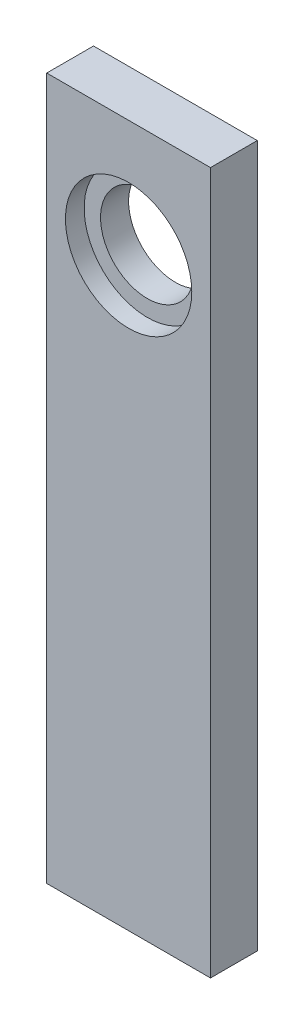
ISO-10303-21;
HEADER;
FILE_DESCRIPTION(('STEP AP214'),'2;1');
FILE_NAME('part.step','',(''),(''),'','','');
FILE_SCHEMA(('AUTOMOTIVE_DESIGN { 1 0 10303 214 1 1 1 1 }'));
ENDSEC;
DATA;
#1=APPLICATION_CONTEXT('core data for automotive mechanical design processes');
#2=APPLICATION_PROTOCOL_DEFINITION('international standard','automotive_design',2000,#1);
#3=PRODUCT_CONTEXT('',#1,'mechanical');
#4=PRODUCT('Part','Part','',(#3));
#5=PRODUCT_RELATED_PRODUCT_CATEGORY('part','',(#4));
#6=PRODUCT_DEFINITION_FORMATION('','',#4);
#7=PRODUCT_DEFINITION_CONTEXT('part definition',#1,'design');
#8=PRODUCT_DEFINITION('design','',#6,#7);
#9=PRODUCT_DEFINITION_SHAPE('','',#8);
#10=(LENGTH_UNIT() NAMED_UNIT(*) SI_UNIT(.MILLI.,.METRE.));
#11=(NAMED_UNIT(*) PLANE_ANGLE_UNIT() SI_UNIT($,.RADIAN.));
#12=(NAMED_UNIT(*) SI_UNIT($,.STERADIAN.) SOLID_ANGLE_UNIT());
#13=UNCERTAINTY_MEASURE_WITH_UNIT(LENGTH_MEASURE(1.E-05),#10,'distance_accuracy_value','');
#14=(GEOMETRIC_REPRESENTATION_CONTEXT(3) GLOBAL_UNCERTAINTY_ASSIGNED_CONTEXT((#13)) GLOBAL_UNIT_ASSIGNED_CONTEXT((#10,
#11,#12)) REPRESENTATION_CONTEXT('',''));
#15=CARTESIAN_POINT('',(0.,0.,0.));
#16=DIRECTION('',(0.,0.,1.));
#17=DIRECTION('',(1.,0.,0.));
#18=AXIS2_PLACEMENT_3D('',#15,#16,#17);
#19=CARTESIAN_POINT('',(-17.5,-25.,10.));
#20=DIRECTION('',(0.,1.,0.));
#21=DIRECTION('',(0.,0.,1.));
#22=AXIS2_PLACEMENT_3D('',#19,#20,#21);
#23=PLANE('',#22);
#24=DIRECTION('',(1.,0.,0.));
#25=VECTOR('',#24,1.);
#26=CARTESIAN_POINT('',(-17.5,-25.,0.));
#27=LINE('',#26,#25);
#28=CARTESIAN_POINT('',(-17.5,-25.,0.));
#29=VERTEX_POINT('',#28);
#30=CARTESIAN_POINT('',(17.5,-25.,0.));
#31=VERTEX_POINT('',#30);
#32=EDGE_CURVE('E93',#29,#31,#27,.T.);
#33=ORIENTED_EDGE('',*,*,#32,.T.);
#34=DIRECTION('',(0.,0.,-1.));
#35=VECTOR('',#34,1.);
#36=CARTESIAN_POINT('',(17.5,-25.,10.));
#37=LINE('',#36,#35);
#38=CARTESIAN_POINT('',(17.5,-25.,10.));
#39=VERTEX_POINT('',#38);
#40=EDGE_CURVE('E46',#39,#31,#37,.T.);
#41=ORIENTED_EDGE('',*,*,#40,.F.);
#42=DIRECTION('',(1.,0.,0.));
#43=VECTOR('',#42,1.);
#44=CARTESIAN_POINT('',(-17.5,-25.,10.));
#45=LINE('',#44,#43);
#46=CARTESIAN_POINT('',(-17.5,-25.,10.));
#47=VERTEX_POINT('',#46);
#48=EDGE_CURVE('E85',#47,#39,#45,.T.);
#49=ORIENTED_EDGE('',*,*,#48,.F.);
#50=DIRECTION('',(0.,0.,-1.));
#51=VECTOR('',#50,1.);
#52=CARTESIAN_POINT('',(-17.5,-25.,10.));
#53=LINE('',#52,#51);
#54=EDGE_CURVE('E11',#47,#29,#53,.T.);
#55=ORIENTED_EDGE('',*,*,#54,.T.);
#56=EDGE_LOOP('',(#33,#41,#49,#55));
#57=FACE_BOUND('',#56,.T.);
#58=ADVANCED_FACE('F37',(#57),#23,.F.);
#59=CARTESIAN_POINT('',(17.5,125.,10.));
#60=DIRECTION('',(-1.,0.,0.));
#61=DIRECTION('',(0.,-1.,0.));
#62=AXIS2_PLACEMENT_3D('',#59,#60,#61);
#63=PLANE('',#62);
#64=DIRECTION('',(0.,1.,0.));
#65=VECTOR('',#64,1.);
#66=CARTESIAN_POINT('',(17.5,125.,0.));
#67=LINE('',#66,#65);
#68=CARTESIAN_POINT('',(17.5,125.,0.));
#69=VERTEX_POINT('',#68);
#70=EDGE_CURVE('E72',#31,#69,#67,.T.);
#71=ORIENTED_EDGE('',*,*,#70,.T.);
#72=DIRECTION('',(0.,0.,-1.));
#73=VECTOR('',#72,1.);
#74=CARTESIAN_POINT('',(17.5,125.,10.));
#75=LINE('',#74,#73);
#76=CARTESIAN_POINT('',(17.5,125.,10.));
#77=VERTEX_POINT('',#76);
#78=EDGE_CURVE('E95',#77,#69,#75,.T.);
#79=ORIENTED_EDGE('',*,*,#78,.F.);
#80=DIRECTION('',(0.,1.,0.));
#81=VECTOR('',#80,1.);
#82=CARTESIAN_POINT('',(17.5,125.,10.));
#83=LINE('',#82,#81);
#84=EDGE_CURVE('E89',#39,#77,#83,.T.);
#85=ORIENTED_EDGE('',*,*,#84,.F.);
#86=ORIENTED_EDGE('',*,*,#40,.T.);
#87=EDGE_LOOP('',(#71,#79,#85,#86));
#88=FACE_BOUND('',#87,.T.);
#89=ADVANCED_FACE('F96',(#88),#63,.F.);
#90=CARTESIAN_POINT('',(-17.5,125.,10.));
#91=DIRECTION('',(0.,-1.,0.));
#92=DIRECTION('',(0.,0.,-1.));
#93=AXIS2_PLACEMENT_3D('',#90,#91,#92);
#94=PLANE('',#93);
#95=DIRECTION('',(-1.,0.,0.));
#96=VECTOR('',#95,1.);
#97=CARTESIAN_POINT('',(-17.5,125.,0.));
#98=LINE('',#97,#96);
#99=CARTESIAN_POINT('',(-17.5,125.,0.));
#100=VERTEX_POINT('',#99);
#101=EDGE_CURVE('E79',#69,#100,#98,.T.);
#102=ORIENTED_EDGE('',*,*,#101,.T.);
#103=DIRECTION('',(0.,0.,-1.));
#104=VECTOR('',#103,1.);
#105=CARTESIAN_POINT('',(-17.5,125.,10.));
#106=LINE('',#105,#104);
#107=CARTESIAN_POINT('',(-17.5,125.,10.));
#108=VERTEX_POINT('',#107);
#109=EDGE_CURVE('E102',#108,#100,#106,.T.);
#110=ORIENTED_EDGE('',*,*,#109,.F.);
#111=DIRECTION('',(-1.,0.,0.));
#112=VECTOR('',#111,1.);
#113=CARTESIAN_POINT('',(-17.5,125.,10.));
#114=LINE('',#113,#112);
#115=EDGE_CURVE('E99',#77,#108,#114,.T.);
#116=ORIENTED_EDGE('',*,*,#115,.F.);
#117=ORIENTED_EDGE('',*,*,#78,.T.);
#118=EDGE_LOOP('',(#102,#110,#116,#117));
#119=FACE_BOUND('',#118,.T.);
#120=ADVANCED_FACE('F119',(#119),#94,.F.);
#121=CARTESIAN_POINT('',(-17.5,25.,10.));
#122=DIRECTION('',(1.,0.,0.));
#123=DIRECTION('',(0.,1.,0.));
#124=AXIS2_PLACEMENT_3D('',#121,#122,#123);
#125=PLANE('',#124);
#126=DIRECTION('',(0.,-1.,0.));
#127=VECTOR('',#126,1.);
#128=CARTESIAN_POINT('',(-17.5,25.,0.));
#129=LINE('',#128,#127);
#130=EDGE_CURVE('E113',#100,#29,#129,.T.);
#131=ORIENTED_EDGE('',*,*,#130,.T.);
#132=ORIENTED_EDGE('',*,*,#54,.F.);
#133=DIRECTION('',(0.,-1.,0.));
#134=VECTOR('',#133,1.);
#135=CARTESIAN_POINT('',(-17.5,-25.,10.));
#136=LINE('',#135,#134);
#137=EDGE_CURVE('E54',#108,#47,#136,.T.);
#138=ORIENTED_EDGE('',*,*,#137,.F.);
#139=ORIENTED_EDGE('',*,*,#109,.T.);
#140=EDGE_LOOP('',(#131,#132,#138,#139));
#141=FACE_BOUND('',#140,.T.);
#142=ADVANCED_FACE('F123',(#141),#125,.F.);
#143=CARTESIAN_POINT('',(0.,0.,10.));
#144=DIRECTION('',(0.,0.,-1.));
#145=DIRECTION('',(-1.,0.,0.));
#146=AXIS2_PLACEMENT_3D('',#143,#144,#145);
#147=PLANE('',#146);
#148=CARTESIAN_POINT('',(0.,100.,10.));
#149=DIRECTION('',(0.,0.,1.));
#150=DIRECTION('',(1.,0.,0.));
#151=AXIS2_PLACEMENT_3D('',#148,#149,#150);
#152=CIRCLE('',#151,13.5);
#153=CARTESIAN_POINT('',(13.5,100.,10.));
#154=VERTEX_POINT('',#153);
#155=EDGE_CURVE('E207',#154,#154,#152,.T.);
#156=ORIENTED_EDGE('',*,*,#155,.F.);
#157=EDGE_LOOP('',(#156));
#158=FACE_BOUND('',#157,.T.);
#159=ORIENTED_EDGE('',*,*,#137,.T.);
#160=ORIENTED_EDGE('',*,*,#48,.T.);
#161=ORIENTED_EDGE('',*,*,#84,.T.);
#162=ORIENTED_EDGE('',*,*,#115,.T.);
#163=EDGE_LOOP('',(#159,#160,#161,#162));
#164=FACE_BOUND('',#163,.T.);
#165=ADVANCED_FACE('F87',(#158,#164),#147,.F.);
#166=CARTESIAN_POINT('',(0.,0.,0.));
#167=DIRECTION('',(0.,0.,-1.));
#168=DIRECTION('',(-1.,0.,0.));
#169=AXIS2_PLACEMENT_3D('',#166,#167,#168);
#170=PLANE('',#169);
#171=CARTESIAN_POINT('',(0.,100.,0.));
#172=DIRECTION('',(0.,0.,1.));
#173=DIRECTION('',(1.,0.,0.));
#174=AXIS2_PLACEMENT_3D('',#171,#172,#173);
#175=CIRCLE('',#174,10.);
#176=CARTESIAN_POINT('',(10.,100.,0.));
#177=VERTEX_POINT('',#176);
#178=EDGE_CURVE('E200',#177,#177,#175,.T.);
#179=ORIENTED_EDGE('',*,*,#178,.T.);
#180=EDGE_LOOP('',(#179));
#181=FACE_BOUND('',#180,.T.);
#182=ORIENTED_EDGE('',*,*,#32,.F.);
#183=ORIENTED_EDGE('',*,*,#130,.F.);
#184=ORIENTED_EDGE('',*,*,#101,.F.);
#185=ORIENTED_EDGE('',*,*,#70,.F.);
#186=EDGE_LOOP('',(#182,#183,#184,#185));
#187=FACE_BOUND('',#186,.T.);
#188=ADVANCED_FACE('F122',(#181,#187),#170,.T.);
#189=CARTESIAN_POINT('',(0.,100.,6.));
#190=DIRECTION('',(0.,0.,1.));
#191=DIRECTION('',(1.,0.,0.));
#192=AXIS2_PLACEMENT_3D('',#189,#190,#191);
#193=CYLINDRICAL_SURFACE('',#192,13.5);
#194=CARTESIAN_POINT('',(0.,100.,6.));
#195=DIRECTION('',(0.,0.,1.));
#196=DIRECTION('',(1.,0.,0.));
#197=AXIS2_PLACEMENT_3D('',#194,#195,#196);
#198=CIRCLE('',#197,13.5);
#199=CARTESIAN_POINT('',(13.5,100.,6.));
#200=VERTEX_POINT('',#199);
#201=EDGE_CURVE('E108',#200,#200,#198,.T.);
#202=ORIENTED_EDGE('',*,*,#201,.F.);
#203=EDGE_LOOP('',(#202));
#204=FACE_BOUND('',#203,.T.);
#205=ORIENTED_EDGE('',*,*,#155,.T.);
#206=EDGE_LOOP('',(#205));
#207=FACE_BOUND('',#206,.T.);
#208=ADVANCED_FACE('F162',(#204,#207),#193,.F.);
#209=CARTESIAN_POINT('',(0.,100.,6.));
#210=DIRECTION('',(0.,0.,1.));
#211=DIRECTION('',(1.,0.,0.));
#212=AXIS2_PLACEMENT_3D('',#209,#210,#211);
#213=PLANE('',#212);
#214=CARTESIAN_POINT('',(0.,100.,6.));
#215=DIRECTION('',(0.,0.,1.));
#216=DIRECTION('',(1.,0.,0.));
#217=AXIS2_PLACEMENT_3D('',#214,#215,#216);
#218=CIRCLE('',#217,10.);
#219=CARTESIAN_POINT('',(10.,100.,6.));
#220=VERTEX_POINT('',#219);
#221=EDGE_CURVE('E203',#220,#220,#218,.T.);
#222=ORIENTED_EDGE('',*,*,#221,.F.);
#223=EDGE_LOOP('',(#222));
#224=FACE_BOUND('',#223,.T.);
#225=ORIENTED_EDGE('',*,*,#201,.T.);
#226=EDGE_LOOP('',(#225));
#227=FACE_BOUND('',#226,.T.);
#228=ADVANCED_FACE('F167',(#224,#227),#213,.T.);
#229=CARTESIAN_POINT('',(0.,100.,0.));
#230=DIRECTION('',(0.,0.,1.));
#231=DIRECTION('',(1.,0.,0.));
#232=AXIS2_PLACEMENT_3D('',#229,#230,#231);
#233=CYLINDRICAL_SURFACE('',#232,10.);
#234=ORIENTED_EDGE('',*,*,#178,.F.);
#235=EDGE_LOOP('',(#234));
#236=FACE_BOUND('',#235,.T.);
#237=ORIENTED_EDGE('',*,*,#221,.T.);
#238=EDGE_LOOP('',(#237));
#239=FACE_BOUND('',#238,.T.);
#240=ADVANCED_FACE('F183',(#236,#239),#233,.F.);
#241=CLOSED_SHELL('',(#58,#89,#120,#142,#165,#188,#208,#228,#240));
#242=MANIFOLD_SOLID_BREP('B2',#241);
#243=ADVANCED_BREP_SHAPE_REPRESENTATION('',(#18,#242),#14);
#244=SHAPE_DEFINITION_REPRESENTATION(#9,#243);
ENDSEC;
END-ISO-10303-21;
